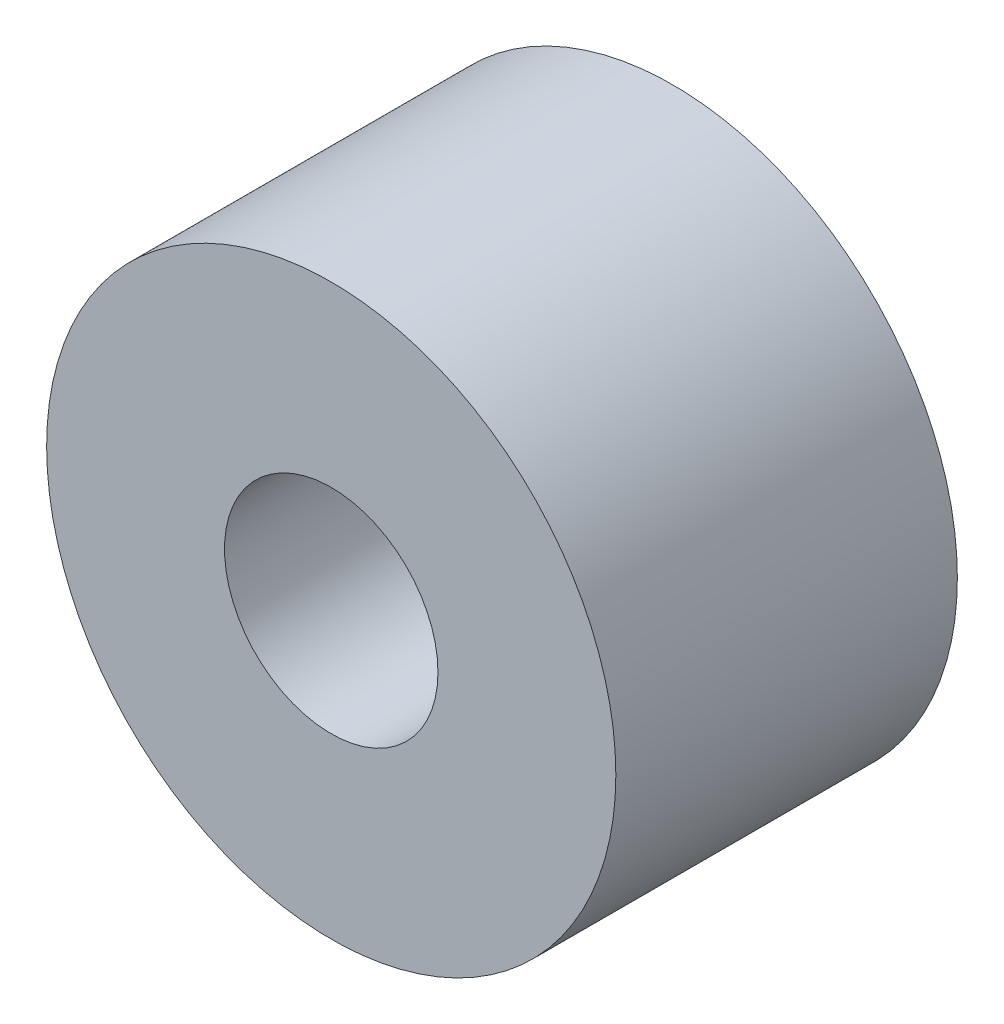
ISO-10303-21;
HEADER;
FILE_DESCRIPTION(('STEP AP214'),'2;1');
FILE_NAME('part.step','',(''),(''),'','','');
FILE_SCHEMA(('AUTOMOTIVE_DESIGN { 1 0 10303 214 1 1 1 1 }'));
ENDSEC;
DATA;
#1=APPLICATION_CONTEXT('core data for automotive mechanical design processes');
#2=APPLICATION_PROTOCOL_DEFINITION('international standard','automotive_design',2000,#1);
#3=PRODUCT_CONTEXT('',#1,'mechanical');
#4=PRODUCT('Part','Part','',(#3));
#5=PRODUCT_RELATED_PRODUCT_CATEGORY('part','',(#4));
#6=PRODUCT_DEFINITION_FORMATION('','',#4);
#7=PRODUCT_DEFINITION_CONTEXT('part definition',#1,'design');
#8=PRODUCT_DEFINITION('design','',#6,#7);
#9=PRODUCT_DEFINITION_SHAPE('','',#8);
#10=(LENGTH_UNIT() NAMED_UNIT(*) SI_UNIT(.MILLI.,.METRE.));
#11=(NAMED_UNIT(*) PLANE_ANGLE_UNIT() SI_UNIT($,.RADIAN.));
#12=(NAMED_UNIT(*) SI_UNIT($,.STERADIAN.) SOLID_ANGLE_UNIT());
#13=UNCERTAINTY_MEASURE_WITH_UNIT(LENGTH_MEASURE(1.E-05),#10,'distance_accuracy_value','');
#14=(GEOMETRIC_REPRESENTATION_CONTEXT(3) GLOBAL_UNCERTAINTY_ASSIGNED_CONTEXT((#13)) GLOBAL_UNIT_ASSIGNED_CONTEXT((#10,
#11,#12)) REPRESENTATION_CONTEXT('',''));
#15=CARTESIAN_POINT('',(0.,0.,0.));
#16=DIRECTION('',(0.,0.,1.));
#17=DIRECTION('',(1.,0.,0.));
#18=AXIS2_PLACEMENT_3D('',#15,#16,#17);
#19=CARTESIAN_POINT('',(-12.7,0.,-15.24));
#20=DIRECTION('',(0.,0.,1.));
#21=DIRECTION('',(1.,0.,0.));
#22=AXIS2_PLACEMENT_3D('',#19,#20,#21);
#23=PLANE('',#22);
#24=CARTESIAN_POINT('',(0.,0.,-15.24));
#25=DIRECTION('',(0.,0.,1.));
#26=DIRECTION('',(1.,0.,0.));
#27=AXIS2_PLACEMENT_3D('',#24,#25,#26);
#28=CIRCLE('',#27,12.7);
#29=CARTESIAN_POINT('',(12.7,0.,-15.24));
#30=VERTEX_POINT('',#29);
#31=EDGE_CURVE('E54',#30,#30,#28,.T.);
#32=ORIENTED_EDGE('',*,*,#31,.F.);
#33=EDGE_LOOP('',(#32));
#34=FACE_BOUND('',#33,.T.);
#35=CARTESIAN_POINT('',(0.,0.,-15.24));
#36=DIRECTION('',(0.,0.,1.));
#37=DIRECTION('',(1.,0.,0.));
#38=AXIS2_PLACEMENT_3D('',#35,#36,#37);
#39=CIRCLE('',#38,4.7625);
#40=CARTESIAN_POINT('',(4.7625,0.,-15.24));
#41=VERTEX_POINT('',#40);
#42=EDGE_CURVE('E10',#41,#41,#39,.T.);
#43=ORIENTED_EDGE('',*,*,#42,.T.);
#44=EDGE_LOOP('',(#43));
#45=FACE_BOUND('',#44,.T.);
#46=ADVANCED_FACE('F37',(#34,#45),#23,.F.);
#47=CARTESIAN_POINT('',(0.,0.,0.));
#48=DIRECTION('',(0.,0.,1.));
#49=DIRECTION('',(1.,0.,0.));
#50=AXIS2_PLACEMENT_3D('',#47,#48,#49);
#51=CYLINDRICAL_SURFACE('',#50,4.7625);
#52=ORIENTED_EDGE('',*,*,#42,.F.);
#53=EDGE_LOOP('',(#52));
#54=FACE_BOUND('',#53,.T.);
#55=CARTESIAN_POINT('',(0.,0.,0.));
#56=DIRECTION('',(0.,0.,1.));
#57=DIRECTION('',(1.,0.,0.));
#58=AXIS2_PLACEMENT_3D('',#55,#56,#57);
#59=CIRCLE('',#58,4.7625);
#60=CARTESIAN_POINT('',(4.7625,0.,0.));
#61=VERTEX_POINT('',#60);
#62=EDGE_CURVE('E44',#61,#61,#59,.T.);
#63=ORIENTED_EDGE('',*,*,#62,.T.);
#64=EDGE_LOOP('',(#63));
#65=FACE_BOUND('',#64,.T.);
#66=ADVANCED_FACE('F64',(#54,#65),#51,.F.);
#67=CARTESIAN_POINT('',(-12.7,0.,0.));
#68=DIRECTION('',(0.,0.,-1.));
#69=DIRECTION('',(-1.,0.,0.));
#70=AXIS2_PLACEMENT_3D('',#67,#68,#69);
#71=PLANE('',#70);
#72=ORIENTED_EDGE('',*,*,#62,.F.);
#73=EDGE_LOOP('',(#72));
#74=FACE_BOUND('',#73,.T.);
#75=CARTESIAN_POINT('',(0.,0.,0.));
#76=DIRECTION('',(0.,0.,1.));
#77=DIRECTION('',(1.,0.,0.));
#78=AXIS2_PLACEMENT_3D('',#75,#76,#77);
#79=CIRCLE('',#78,12.7);
#80=CARTESIAN_POINT('',(12.7,0.,0.));
#81=VERTEX_POINT('',#80);
#82=EDGE_CURVE('E49',#81,#81,#79,.T.);
#83=ORIENTED_EDGE('',*,*,#82,.T.);
#84=EDGE_LOOP('',(#83));
#85=FACE_BOUND('',#84,.T.);
#86=ADVANCED_FACE('F68',(#74,#85),#71,.F.);
#87=CARTESIAN_POINT('',(0.,0.,0.));
#88=DIRECTION('',(0.,0.,1.));
#89=DIRECTION('',(1.,0.,0.));
#90=AXIS2_PLACEMENT_3D('',#87,#88,#89);
#91=CYLINDRICAL_SURFACE('',#90,12.7);
#92=ORIENTED_EDGE('',*,*,#82,.F.);
#93=EDGE_LOOP('',(#92));
#94=FACE_BOUND('',#93,.T.);
#95=ORIENTED_EDGE('',*,*,#31,.T.);
#96=EDGE_LOOP('',(#95));
#97=FACE_BOUND('',#96,.T.);
#98=ADVANCED_FACE('F61',(#94,#97),#91,.T.);
#99=CLOSED_SHELL('',(#46,#66,#86,#98));
#100=MANIFOLD_SOLID_BREP('B2',#99);
#101=ADVANCED_BREP_SHAPE_REPRESENTATION('',(#18,#100),#14);
#102=SHAPE_DEFINITION_REPRESENTATION(#9,#101);
ENDSEC;
END-ISO-10303-21;
